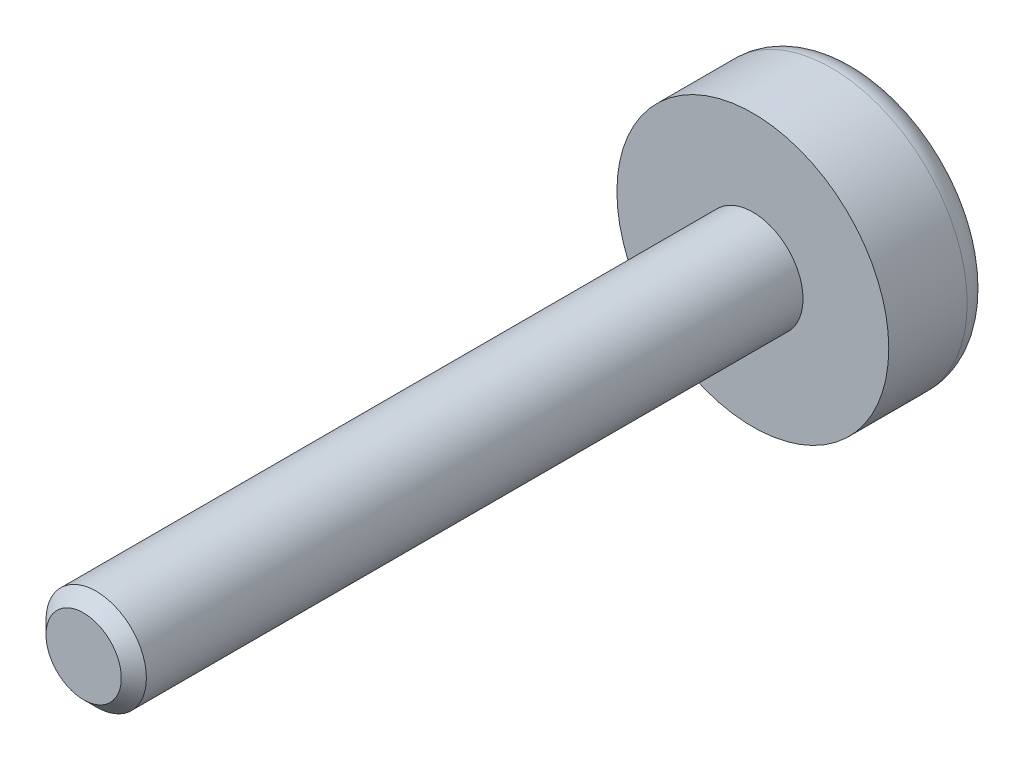
ISO-10303-21;
HEADER;
FILE_DESCRIPTION(('STEP AP214'),'2;1');
FILE_NAME('part.step','',(''),(''),'','','');
FILE_SCHEMA(('AUTOMOTIVE_DESIGN { 1 0 10303 214 1 1 1 1 }'));
ENDSEC;
DATA;
#1=APPLICATION_CONTEXT('core data for automotive mechanical design processes');
#2=APPLICATION_PROTOCOL_DEFINITION('international standard','automotive_design',2000,#1);
#3=PRODUCT_CONTEXT('',#1,'mechanical');
#4=PRODUCT('Part','Part','',(#3));
#5=PRODUCT_RELATED_PRODUCT_CATEGORY('part','',(#4));
#6=PRODUCT_DEFINITION_FORMATION('','',#4);
#7=PRODUCT_DEFINITION_CONTEXT('part definition',#1,'design');
#8=PRODUCT_DEFINITION('design','',#6,#7);
#9=PRODUCT_DEFINITION_SHAPE('','',#8);
#10=(LENGTH_UNIT() NAMED_UNIT(*) SI_UNIT(.MILLI.,.METRE.));
#11=(NAMED_UNIT(*) PLANE_ANGLE_UNIT() SI_UNIT($,.RADIAN.));
#12=(NAMED_UNIT(*) SI_UNIT($,.STERADIAN.) SOLID_ANGLE_UNIT());
#13=UNCERTAINTY_MEASURE_WITH_UNIT(LENGTH_MEASURE(1.E-05),#10,'distance_accuracy_value','');
#14=(GEOMETRIC_REPRESENTATION_CONTEXT(3) GLOBAL_UNCERTAINTY_ASSIGNED_CONTEXT((#13)) GLOBAL_UNIT_ASSIGNED_CONTEXT((#10,
#11,#12)) REPRESENTATION_CONTEXT('',''));
#15=CARTESIAN_POINT('',(0.,0.,0.));
#16=DIRECTION('',(0.,0.,1.));
#17=DIRECTION('',(1.,0.,0.));
#18=AXIS2_PLACEMENT_3D('',#15,#16,#17);
#19=CARTESIAN_POINT('',(0.,0.,16.));
#20=DIRECTION('',(0.,0.,1.));
#21=DIRECTION('',(-1.,0.,0.));
#22=AXIS2_PLACEMENT_3D('',#19,#20,#21);
#23=PLANE('',#22);
#24=CARTESIAN_POINT('',(0.,0.,16.));
#25=DIRECTION('',(0.,0.,-1.));
#26=DIRECTION('',(-1.,0.,0.));
#27=AXIS2_PLACEMENT_3D('',#24,#25,#26);
#28=CIRCLE('',#27,0.9);
#29=CARTESIAN_POINT('',(-0.9,0.,16.));
#30=VERTEX_POINT('',#29);
#31=EDGE_CURVE('E140',#30,#30,#28,.T.);
#32=ORIENTED_EDGE('',*,*,#31,.F.);
#33=EDGE_LOOP('',(#32));
#34=FACE_BOUND('',#33,.T.);
#35=ADVANCED_FACE('F41',(#34),#23,.T.);
#36=CARTESIAN_POINT('',(0.,0.,-10.123));
#37=DIRECTION('',(0.,0.,-1.));
#38=DIRECTION('',(1.,0.,0.));
#39=AXIS2_PLACEMENT_3D('',#36,#37,#38);
#40=CYLINDRICAL_SURFACE('',#39,1.2);
#41=CARTESIAN_POINT('',(0.,0.,15.7));
#42=DIRECTION('',(0.,0.,-1.));
#43=DIRECTION('',(-1.,0.,0.));
#44=AXIS2_PLACEMENT_3D('',#41,#42,#43);
#45=CIRCLE('',#44,1.2);
#46=CARTESIAN_POINT('',(-1.2,0.,15.7));
#47=VERTEX_POINT('',#46);
#48=EDGE_CURVE('E137',#47,#47,#45,.F.);
#49=ORIENTED_EDGE('',*,*,#48,.F.);
#50=EDGE_LOOP('',(#49));
#51=FACE_BOUND('',#50,.T.);
#52=CARTESIAN_POINT('',(0.,0.,0.));
#53=DIRECTION('',(0.,0.,1.));
#54=DIRECTION('',(1.,0.,0.));
#55=AXIS2_PLACEMENT_3D('',#52,#53,#54);
#56=CIRCLE('',#55,1.2);
#57=CARTESIAN_POINT('',(1.2,0.,0.));
#58=VERTEX_POINT('',#57);
#59=EDGE_CURVE('E134',#58,#58,#56,.T.);
#60=ORIENTED_EDGE('',*,*,#59,.T.);
#61=EDGE_LOOP('',(#60));
#62=FACE_BOUND('',#61,.T.);
#63=ADVANCED_FACE('F163',(#51,#62),#40,.T.);
#64=CARTESIAN_POINT('',(1.2,0.,0.));
#65=DIRECTION('',(0.,0.,1.));
#66=DIRECTION('',(-1.,0.,0.));
#67=AXIS2_PLACEMENT_3D('',#64,#65,#66);
#68=PLANE('',#67);
#69=ORIENTED_EDGE('',*,*,#59,.F.);
#70=EDGE_LOOP('',(#69));
#71=FACE_BOUND('',#70,.T.);
#72=CARTESIAN_POINT('',(0.,0.,0.));
#73=DIRECTION('',(0.,0.,1.));
#74=DIRECTION('',(1.,0.,0.));
#75=AXIS2_PLACEMENT_3D('',#72,#73,#74);
#76=CIRCLE('',#75,3.25);
#77=CARTESIAN_POINT('',(3.25,0.,0.));
#78=VERTEX_POINT('',#77);
#79=EDGE_CURVE('E131',#78,#78,#76,.T.);
#80=ORIENTED_EDGE('',*,*,#79,.T.);
#81=EDGE_LOOP('',(#80));
#82=FACE_BOUND('',#81,.T.);
#83=ADVANCED_FACE('F157',(#71,#82),#68,.T.);
#84=CARTESIAN_POINT('',(0.,0.,-10.123));
#85=DIRECTION('',(0.,0.,-1.));
#86=DIRECTION('',(1.,0.,0.));
#87=AXIS2_PLACEMENT_3D('',#84,#85,#86);
#88=CYLINDRICAL_SURFACE('',#87,3.25);
#89=CARTESIAN_POINT('',(0.,0.,-1.875));
#90=DIRECTION('',(0.,0.,1.));
#91=DIRECTION('',(1.,0.,0.));
#92=AXIS2_PLACEMENT_3D('',#89,#90,#91);
#93=CIRCLE('',#92,3.25);
#94=CARTESIAN_POINT('',(3.25,0.,-1.875));
#95=VERTEX_POINT('',#94);
#96=EDGE_CURVE('E11',#95,#95,#93,.F.);
#97=ORIENTED_EDGE('',*,*,#96,.F.);
#98=EDGE_LOOP('',(#97));
#99=FACE_BOUND('',#98,.T.);
#100=ORIENTED_EDGE('',*,*,#79,.F.);
#101=EDGE_LOOP('',(#100));
#102=FACE_BOUND('',#101,.T.);
#103=ADVANCED_FACE('F149',(#99,#102),#88,.T.);
#104=CARTESIAN_POINT('',(3.25,0.,-2.5));
#105=DIRECTION('',(0.,0.,-1.));
#106=DIRECTION('',(1.,0.,0.));
#107=AXIS2_PLACEMENT_3D('',#104,#105,#106);
#108=PLANE('',#107);
#109=DIRECTION('',(0.499999999999995,0.866025403784441,0.));
#110=VECTOR('',#109,1.);
#111=CARTESIAN_POINT('',(0.577350269189637,-0.999999999999993,-2.5));
#112=LINE('',#111,#110);
#113=CARTESIAN_POINT('',(0.577350269189637,-0.999999999999993,-2.5));
#114=VERTEX_POINT('',#113);
#115=CARTESIAN_POINT('',(1.15470053837925,0.,-2.5));
#116=VERTEX_POINT('',#115);
#117=EDGE_CURVE('E315',#114,#116,#112,.T.);
#118=ORIENTED_EDGE('',*,*,#117,.T.);
#119=DIRECTION('',(-0.500000000000001,0.866025403784438,0.));
#120=VECTOR('',#119,1.);
#121=CARTESIAN_POINT('',(1.15470053837925,0.,-2.5));
#122=LINE('',#121,#120);
#123=CARTESIAN_POINT('',(0.577350269189624,1.,-2.5));
#124=VERTEX_POINT('',#123);
#125=EDGE_CURVE('E310',#116,#124,#122,.T.);
#126=ORIENTED_EDGE('',*,*,#125,.T.);
#127=DIRECTION('',(-1.,0.,0.));
#128=VECTOR('',#127,1.);
#129=CARTESIAN_POINT('',(0.577350269189624,1.,-2.5));
#130=LINE('',#129,#128);
#131=CARTESIAN_POINT('',(-0.57735026918963,0.999999999999998,-2.5));
#132=VERTEX_POINT('',#131);
#133=EDGE_CURVE('E314',#124,#132,#130,.T.);
#134=ORIENTED_EDGE('',*,*,#133,.T.);
#135=DIRECTION('',(-0.499999999999995,-0.866025403784442,0.));
#136=VECTOR('',#135,1.);
#137=CARTESIAN_POINT('',(-0.57735026918963,0.999999999999998,-2.5));
#138=LINE('',#137,#136);
#139=CARTESIAN_POINT('',(-1.15470053837925,0.,-2.5));
#140=VERTEX_POINT('',#139);
#141=EDGE_CURVE('E322',#132,#140,#138,.T.);
#142=ORIENTED_EDGE('',*,*,#141,.T.);
#143=DIRECTION('',(0.500000000000007,-0.866025403784434,0.));
#144=VECTOR('',#143,1.);
#145=CARTESIAN_POINT('',(-1.15470053837925,0.,-2.5));
#146=LINE('',#145,#144);
#147=CARTESIAN_POINT('',(-0.577350269189617,-1.00000000000001,-2.5));
#148=VERTEX_POINT('',#147);
#149=EDGE_CURVE('E120',#140,#148,#146,.T.);
#150=ORIENTED_EDGE('',*,*,#149,.T.);
#151=DIRECTION('',(1.,0.,0.));
#152=VECTOR('',#151,1.);
#153=CARTESIAN_POINT('',(-0.577350269189617,-1.00000000000001,-2.5));
#154=LINE('',#153,#152);
#155=EDGE_CURVE('E317',#148,#114,#154,.T.);
#156=ORIENTED_EDGE('',*,*,#155,.T.);
#157=EDGE_LOOP('',(#118,#126,#134,#142,#150,#156));
#158=FACE_BOUND('',#157,.T.);
#159=CARTESIAN_POINT('',(0.,0.,-2.5));
#160=DIRECTION('',(0.,0.,1.));
#161=DIRECTION('',(1.,0.,0.));
#162=AXIS2_PLACEMENT_3D('',#159,#160,#161);
#163=CIRCLE('',#162,2.625);
#164=CARTESIAN_POINT('',(2.625,0.,-2.5));
#165=VERTEX_POINT('',#164);
#166=EDGE_CURVE('E49',#165,#165,#163,.T.);
#167=ORIENTED_EDGE('',*,*,#166,.F.);
#168=EDGE_LOOP('',(#167));
#169=FACE_BOUND('',#168,.T.);
#170=ADVANCED_FACE('F146',(#158,#169),#108,.T.);
#171=CARTESIAN_POINT('',(0.,0.,15.7));
#172=DIRECTION('',(0.,0.,-1.));
#173=DIRECTION('',(1.,0.,0.));
#174=AXIS2_PLACEMENT_3D('',#171,#172,#173);
#175=CONICAL_SURFACE('',#174,1.2,0.785398163397446);
#176=ORIENTED_EDGE('',*,*,#31,.T.);
#177=EDGE_LOOP('',(#176));
#178=FACE_BOUND('',#177,.T.);
#179=ORIENTED_EDGE('',*,*,#48,.T.);
#180=EDGE_LOOP('',(#179));
#181=FACE_BOUND('',#180,.T.);
#182=ADVANCED_FACE('F148',(#178,#181),#175,.T.);
#183=CARTESIAN_POINT('',(0.,0.,-1.875));
#184=DIRECTION('',(0.,0.,-1.));
#185=DIRECTION('',(1.,0.,0.));
#186=AXIS2_PLACEMENT_3D('',#183,#184,#185);
#187=TOROIDAL_SURFACE('',#186,2.625,0.625);
#188=ORIENTED_EDGE('',*,*,#96,.T.);
#189=EDGE_LOOP('',(#188));
#190=FACE_BOUND('',#189,.T.);
#191=ORIENTED_EDGE('',*,*,#166,.T.);
#192=EDGE_LOOP('',(#191));
#193=FACE_BOUND('',#192,.T.);
#194=ADVANCED_FACE('F43',(#190,#193),#187,.T.);
#195=CARTESIAN_POINT('',(0.577350269189637,-0.999999999999993,-1.125));
#196=DIRECTION('',(0.866025403784441,-0.499999999999995,0.));
#197=DIRECTION('',(0.499999999999995,0.866025403784441,0.));
#198=AXIS2_PLACEMENT_3D('',#195,#196,#197);
#199=PLANE('',#198);
#200=ORIENTED_EDGE('',*,*,#117,.F.);
#201=DIRECTION('',(0.,0.,-1.));
#202=VECTOR('',#201,1.);
#203=CARTESIAN_POINT('',(0.577350269189637,-0.999999999999993,-1.125));
#204=LINE('',#203,#202);
#205=CARTESIAN_POINT('',(0.577350269189637,-0.999999999999993,-1.125));
#206=VERTEX_POINT('',#205);
#207=EDGE_CURVE('E87',#206,#114,#204,.T.);
#208=ORIENTED_EDGE('',*,*,#207,.F.);
#209=DIRECTION('',(0.499999999999995,0.866025403784441,0.));
#210=VECTOR('',#209,1.);
#211=CARTESIAN_POINT('',(0.577350269189637,-0.999999999999993,-1.125));
#212=LINE('',#211,#210);
#213=CARTESIAN_POINT('',(1.15470053837925,0.,-1.125));
#214=VERTEX_POINT('',#213);
#215=EDGE_CURVE('E325',#206,#214,#212,.T.);
#216=ORIENTED_EDGE('',*,*,#215,.T.);
#217=DIRECTION('',(0.,0.,-1.));
#218=VECTOR('',#217,1.);
#219=CARTESIAN_POINT('',(1.15470053837925,0.,-1.125));
#220=LINE('',#219,#218);
#221=EDGE_CURVE('E56',#214,#116,#220,.T.);
#222=ORIENTED_EDGE('',*,*,#221,.T.);
#223=EDGE_LOOP('',(#200,#208,#216,#222));
#224=FACE_BOUND('',#223,.T.);
#225=ADVANCED_FACE('F210',(#224),#199,.F.);
#226=CARTESIAN_POINT('',(-0.577350269189617,-1.00000000000001,-1.125));
#227=DIRECTION('',(0.,-1.,0.));
#228=DIRECTION('',(1.,0.,0.));
#229=AXIS2_PLACEMENT_3D('',#226,#227,#228);
#230=PLANE('',#229);
#231=ORIENTED_EDGE('',*,*,#155,.F.);
#232=DIRECTION('',(0.,0.,-1.));
#233=VECTOR('',#232,1.);
#234=CARTESIAN_POINT('',(-0.577350269189617,-1.00000000000001,-1.125));
#235=LINE('',#234,#233);
#236=CARTESIAN_POINT('',(-0.577350269189617,-1.00000000000001,-1.125));
#237=VERTEX_POINT('',#236);
#238=EDGE_CURVE('E122',#237,#148,#235,.T.);
#239=ORIENTED_EDGE('',*,*,#238,.F.);
#240=DIRECTION('',(1.,0.,0.));
#241=VECTOR('',#240,1.);
#242=CARTESIAN_POINT('',(-0.577350269189617,-1.00000000000001,-1.125));
#243=LINE('',#242,#241);
#244=EDGE_CURVE('E65',#237,#206,#243,.T.);
#245=ORIENTED_EDGE('',*,*,#244,.T.);
#246=ORIENTED_EDGE('',*,*,#207,.T.);
#247=EDGE_LOOP('',(#231,#239,#245,#246));
#248=FACE_BOUND('',#247,.T.);
#249=ADVANCED_FACE('F220',(#248),#230,.F.);
#250=CARTESIAN_POINT('',(-1.15470053837925,0.,-1.125));
#251=DIRECTION('',(-0.866025403784435,-0.500000000000007,0.));
#252=DIRECTION('',(0.500000000000007,-0.866025403784435,0.));
#253=AXIS2_PLACEMENT_3D('',#250,#251,#252);
#254=PLANE('',#253);
#255=ORIENTED_EDGE('',*,*,#149,.F.);
#256=DIRECTION('',(0.,0.,-1.));
#257=VECTOR('',#256,1.);
#258=CARTESIAN_POINT('',(-1.15470053837925,0.,-1.125));
#259=LINE('',#258,#257);
#260=CARTESIAN_POINT('',(-1.15470053837925,0.,-1.125));
#261=VERTEX_POINT('',#260);
#262=EDGE_CURVE('E109',#261,#140,#259,.T.);
#263=ORIENTED_EDGE('',*,*,#262,.F.);
#264=DIRECTION('',(0.500000000000007,-0.866025403784434,0.));
#265=VECTOR('',#264,1.);
#266=CARTESIAN_POINT('',(-1.15470053837925,0.,-1.125));
#267=LINE('',#266,#265);
#268=EDGE_CURVE('E112',#261,#237,#267,.T.);
#269=ORIENTED_EDGE('',*,*,#268,.T.);
#270=ORIENTED_EDGE('',*,*,#238,.T.);
#271=EDGE_LOOP('',(#255,#263,#269,#270));
#272=FACE_BOUND('',#271,.T.);
#273=ADVANCED_FACE('F118',(#272),#254,.F.);
#274=CARTESIAN_POINT('',(-0.57735026918963,0.999999999999998,-1.125));
#275=DIRECTION('',(-0.866025403784442,0.499999999999995,0.));
#276=DIRECTION('',(-0.499999999999995,-0.866025403784441,0.));
#277=AXIS2_PLACEMENT_3D('',#274,#275,#276);
#278=PLANE('',#277);
#279=ORIENTED_EDGE('',*,*,#141,.F.);
#280=DIRECTION('',(0.,0.,-1.));
#281=VECTOR('',#280,1.);
#282=CARTESIAN_POINT('',(-0.57735026918963,0.999999999999998,-1.125));
#283=LINE('',#282,#281);
#284=CARTESIAN_POINT('',(-0.57735026918963,0.999999999999998,-1.125));
#285=VERTEX_POINT('',#284);
#286=EDGE_CURVE('E111',#285,#132,#283,.T.);
#287=ORIENTED_EDGE('',*,*,#286,.F.);
#288=DIRECTION('',(-0.499999999999995,-0.866025403784442,0.));
#289=VECTOR('',#288,1.);
#290=CARTESIAN_POINT('',(-0.57735026918963,0.999999999999998,-1.125));
#291=LINE('',#290,#289);
#292=EDGE_CURVE('E104',#285,#261,#291,.T.);
#293=ORIENTED_EDGE('',*,*,#292,.T.);
#294=ORIENTED_EDGE('',*,*,#262,.T.);
#295=EDGE_LOOP('',(#279,#287,#293,#294));
#296=FACE_BOUND('',#295,.T.);
#297=ADVANCED_FACE('F107',(#296),#278,.F.);
#298=CARTESIAN_POINT('',(0.577350269189624,1.,-1.125));
#299=DIRECTION('',(0.,1.,0.));
#300=DIRECTION('',(-1.,0.,0.));
#301=AXIS2_PLACEMENT_3D('',#298,#299,#300);
#302=PLANE('',#301);
#303=ORIENTED_EDGE('',*,*,#133,.F.);
#304=DIRECTION('',(0.,0.,-1.));
#305=VECTOR('',#304,1.);
#306=CARTESIAN_POINT('',(0.577350269189624,1.,-1.125));
#307=LINE('',#306,#305);
#308=CARTESIAN_POINT('',(0.577350269189624,1.,-1.125));
#309=VERTEX_POINT('',#308);
#310=EDGE_CURVE('E125',#309,#124,#307,.T.);
#311=ORIENTED_EDGE('',*,*,#310,.F.);
#312=DIRECTION('',(-1.,0.,0.));
#313=VECTOR('',#312,1.);
#314=CARTESIAN_POINT('',(0.577350269189624,1.,-1.125));
#315=LINE('',#314,#313);
#316=EDGE_CURVE('E113',#309,#285,#315,.T.);
#317=ORIENTED_EDGE('',*,*,#316,.T.);
#318=ORIENTED_EDGE('',*,*,#286,.T.);
#319=EDGE_LOOP('',(#303,#311,#317,#318));
#320=FACE_BOUND('',#319,.T.);
#321=ADVANCED_FACE('F247',(#320),#302,.F.);
#322=CARTESIAN_POINT('',(1.15470053837925,0.,-1.125));
#323=DIRECTION('',(0.866025403784438,0.500000000000001,0.));
#324=DIRECTION('',(-0.500000000000001,0.866025403784438,0.));
#325=AXIS2_PLACEMENT_3D('',#322,#323,#324);
#326=PLANE('',#325);
#327=ORIENTED_EDGE('',*,*,#125,.F.);
#328=ORIENTED_EDGE('',*,*,#221,.F.);
#329=DIRECTION('',(-0.500000000000001,0.866025403784438,0.));
#330=VECTOR('',#329,1.);
#331=CARTESIAN_POINT('',(1.15470053837925,0.,-1.125));
#332=LINE('',#331,#330);
#333=EDGE_CURVE('E95',#214,#309,#332,.T.);
#334=ORIENTED_EDGE('',*,*,#333,.T.);
#335=ORIENTED_EDGE('',*,*,#310,.T.);
#336=EDGE_LOOP('',(#327,#328,#334,#335));
#337=FACE_BOUND('',#336,.T.);
#338=ADVANCED_FACE('F257',(#337),#326,.F.);
#339=CARTESIAN_POINT('',(0.,0.,-1.125));
#340=DIRECTION('',(0.,0.,-1.));
#341=DIRECTION('',(1.,0.,0.));
#342=AXIS2_PLACEMENT_3D('',#339,#340,#341);
#343=PLANE('',#342);
#344=ORIENTED_EDGE('',*,*,#215,.F.);
#345=ORIENTED_EDGE('',*,*,#244,.F.);
#346=ORIENTED_EDGE('',*,*,#268,.F.);
#347=ORIENTED_EDGE('',*,*,#292,.F.);
#348=ORIENTED_EDGE('',*,*,#316,.F.);
#349=ORIENTED_EDGE('',*,*,#333,.F.);
#350=EDGE_LOOP('',(#344,#345,#346,#347,#348,#349));
#351=FACE_BOUND('',#350,.T.);
#352=ADVANCED_FACE('F115',(#351),#343,.T.);
#353=CLOSED_SHELL('',(#35,#63,#83,#103,#170,#182,#194,#225,#249,#273,#297,#321,#338,#352));
#354=MANIFOLD_SOLID_BREP('B2',#353);
#355=ADVANCED_BREP_SHAPE_REPRESENTATION('',(#18,#354),#14);
#356=SHAPE_DEFINITION_REPRESENTATION(#9,#355);
ENDSEC;
END-ISO-10303-21;
